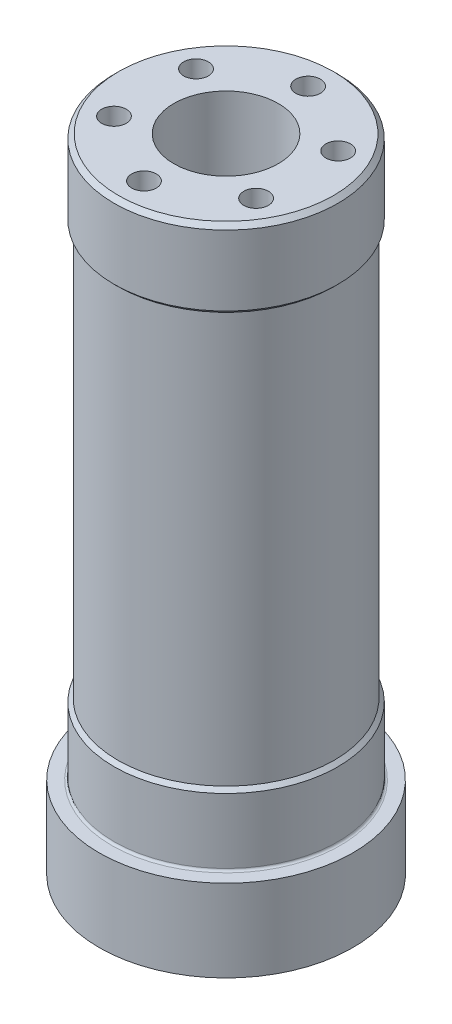
ISO-10303-21;
HEADER;
FILE_DESCRIPTION(('STEP AP214'),'2;1');
FILE_NAME('part.step','',(''),(''),'','','');
FILE_SCHEMA(('AUTOMOTIVE_DESIGN { 1 0 10303 214 1 1 1 1 }'));
ENDSEC;
DATA;
#1=APPLICATION_CONTEXT('core data for automotive mechanical design processes');
#2=APPLICATION_PROTOCOL_DEFINITION('international standard','automotive_design',2000,#1);
#3=PRODUCT_CONTEXT('',#1,'mechanical');
#4=PRODUCT('Part','Part','',(#3));
#5=PRODUCT_RELATED_PRODUCT_CATEGORY('part','',(#4));
#6=PRODUCT_DEFINITION_FORMATION('','',#4);
#7=PRODUCT_DEFINITION_CONTEXT('part definition',#1,'design');
#8=PRODUCT_DEFINITION('design','',#6,#7);
#9=PRODUCT_DEFINITION_SHAPE('','',#8);
#10=(LENGTH_UNIT() NAMED_UNIT(*) SI_UNIT(.MILLI.,.METRE.));
#11=(NAMED_UNIT(*) PLANE_ANGLE_UNIT() SI_UNIT($,.RADIAN.));
#12=(NAMED_UNIT(*) SI_UNIT($,.STERADIAN.) SOLID_ANGLE_UNIT());
#13=UNCERTAINTY_MEASURE_WITH_UNIT(LENGTH_MEASURE(1.E-05),#10,'distance_accuracy_value','');
#14=(GEOMETRIC_REPRESENTATION_CONTEXT(3) GLOBAL_UNCERTAINTY_ASSIGNED_CONTEXT((#13)) GLOBAL_UNIT_ASSIGNED_CONTEXT((#10,
#11,#12)) REPRESENTATION_CONTEXT('',''));
#15=CARTESIAN_POINT('',(0.,0.,0.));
#16=DIRECTION('',(0.,0.,1.));
#17=DIRECTION('',(1.,0.,0.));
#18=AXIS2_PLACEMENT_3D('',#15,#16,#17);
#19=CARTESIAN_POINT('',(0.,110.959510929026,-40.));
#20=DIRECTION('',(0.,1.,0.));
#21=DIRECTION('',(0.,0.,1.));
#22=AXIS2_PLACEMENT_3D('',#19,#20,#21);
#23=CYLINDRICAL_SURFACE('',#22,15.);
#24=CARTESIAN_POINT('',(0.,27.8,-40.));
#25=DIRECTION('',(0.,-1.,0.));
#26=DIRECTION('',(0.,0.,-1.));
#27=AXIS2_PLACEMENT_3D('',#24,#25,#26);
#28=CIRCLE('',#27,15.);
#29=CARTESIAN_POINT('',(0.,27.8,-55.));
#30=VERTEX_POINT('',#29);
#31=EDGE_CURVE('E188',#30,#30,#28,.F.);
#32=ORIENTED_EDGE('',*,*,#31,.T.);
#33=EDGE_LOOP('',(#32));
#34=FACE_BOUND('',#33,.T.);
#35=CARTESIAN_POINT('',(0.,36.5,-40.));
#36=DIRECTION('',(0.,1.,0.));
#37=DIRECTION('',(0.,0.,1.));
#38=AXIS2_PLACEMENT_3D('',#35,#36,#37);
#39=CIRCLE('',#38,15.);
#40=CARTESIAN_POINT('',(0.,36.5,-25.));
#41=VERTEX_POINT('',#40);
#42=EDGE_CURVE('E179',#41,#41,#39,.T.);
#43=ORIENTED_EDGE('',*,*,#42,.F.);
#44=EDGE_LOOP('',(#43));
#45=FACE_BOUND('',#44,.T.);
#46=ADVANCED_FACE('F53',(#34,#45),#23,.T.);
#47=CARTESIAN_POINT('',(0.,110.959510929026,-40.));
#48=DIRECTION('',(0.,1.,0.));
#49=DIRECTION('',(0.,0.,1.));
#50=AXIS2_PLACEMENT_3D('',#47,#48,#49);
#51=CYLINDRICAL_SURFACE('',#50,14.5);
#52=CARTESIAN_POINT('',(0.,37.,-40.));
#53=DIRECTION('',(0.,-1.,0.));
#54=DIRECTION('',(0.,0.,-1.));
#55=AXIS2_PLACEMENT_3D('',#52,#53,#54);
#56=CIRCLE('',#55,14.5);
#57=CARTESIAN_POINT('',(0.,37.,-54.5));
#58=VERTEX_POINT('',#57);
#59=EDGE_CURVE('E197',#58,#58,#56,.F.);
#60=ORIENTED_EDGE('',*,*,#59,.T.);
#61=EDGE_LOOP('',(#60));
#62=FACE_BOUND('',#61,.T.);
#63=CARTESIAN_POINT('',(0.,92.,-40.));
#64=DIRECTION('',(0.,1.,0.));
#65=DIRECTION('',(0.,0.,1.));
#66=AXIS2_PLACEMENT_3D('',#63,#64,#65);
#67=CIRCLE('',#66,14.5);
#68=CARTESIAN_POINT('',(0.,92.,-25.5));
#69=VERTEX_POINT('',#68);
#70=EDGE_CURVE('E194',#69,#69,#67,.F.);
#71=ORIENTED_EDGE('',*,*,#70,.T.);
#72=EDGE_LOOP('',(#71));
#73=FACE_BOUND('',#72,.T.);
#74=ADVANCED_FACE('F216',(#62,#73),#51,.T.);
#75=CARTESIAN_POINT('',(0.,110.959510929026,-40.));
#76=DIRECTION('',(0.,1.,0.));
#77=DIRECTION('',(0.,0.,1.));
#78=AXIS2_PLACEMENT_3D('',#75,#76,#77);
#79=CYLINDRICAL_SURFACE('',#78,15.);
#80=CARTESIAN_POINT('',(0.,101.9,-40.));
#81=DIRECTION('',(0.,-1.,0.));
#82=DIRECTION('',(0.,0.,-1.));
#83=AXIS2_PLACEMENT_3D('',#80,#81,#82);
#84=CIRCLE('',#83,15.);
#85=CARTESIAN_POINT('',(0.,101.9,-55.));
#86=VERTEX_POINT('',#85);
#87=EDGE_CURVE('E185',#86,#86,#84,.T.);
#88=ORIENTED_EDGE('',*,*,#87,.T.);
#89=EDGE_LOOP('',(#88));
#90=FACE_BOUND('',#89,.T.);
#91=CARTESIAN_POINT('',(0.,92.5,-40.));
#92=DIRECTION('',(0.,1.,0.));
#93=DIRECTION('',(0.,0.,1.));
#94=AXIS2_PLACEMENT_3D('',#91,#92,#93);
#95=CIRCLE('',#94,15.);
#96=CARTESIAN_POINT('',(0.,92.5,-25.));
#97=VERTEX_POINT('',#96);
#98=EDGE_CURVE('E176',#97,#97,#95,.T.);
#99=ORIENTED_EDGE('',*,*,#98,.T.);
#100=EDGE_LOOP('',(#99));
#101=FACE_BOUND('',#100,.T.);
#102=ADVANCED_FACE('F224',(#90,#101),#79,.T.);
#103=CARTESIAN_POINT('',(0.,102.5,-55.));
#104=DIRECTION('',(0.,-1.,0.));
#105=DIRECTION('',(0.,0.,-1.));
#106=AXIS2_PLACEMENT_3D('',#103,#104,#105);
#107=PLANE('',#106);
#108=CARTESIAN_POINT('',(0.,102.5,-40.));
#109=DIRECTION('',(0.,-1.,0.));
#110=DIRECTION('',(0.,0.,-1.));
#111=AXIS2_PLACEMENT_3D('',#108,#109,#110);
#112=CIRCLE('',#111,14.4);
#113=CARTESIAN_POINT('',(0.,102.5,-54.4));
#114=VERTEX_POINT('',#113);
#115=EDGE_CURVE('E182',#114,#114,#112,.F.);
#116=ORIENTED_EDGE('',*,*,#115,.T.);
#117=EDGE_LOOP('',(#116));
#118=FACE_BOUND('',#117,.T.);
#119=CARTESIAN_POINT('',(0.,102.5,-51.));
#120=DIRECTION('',(0.,1.,0.));
#121=DIRECTION('',(0.,0.,1.));
#122=AXIS2_PLACEMENT_3D('',#119,#120,#121);
#123=CIRCLE('',#122,1.64999999999999);
#124=CARTESIAN_POINT('',(0.,102.5,-49.35));
#125=VERTEX_POINT('',#124);
#126=EDGE_CURVE('E125',#125,#125,#123,.T.);
#127=ORIENTED_EDGE('',*,*,#126,.F.);
#128=EDGE_LOOP('',(#127));
#129=FACE_BOUND('',#128,.T.);
#130=CARTESIAN_POINT('',(9.52627944162883,102.5,-45.5));
#131=DIRECTION('',(0.,1.,0.));
#132=DIRECTION('',(0.,0.,1.));
#133=AXIS2_PLACEMENT_3D('',#130,#131,#132);
#134=CIRCLE('',#133,1.64999999999999);
#135=CARTESIAN_POINT('',(9.52627944162883,102.5,-43.85));
#136=VERTEX_POINT('',#135);
#137=EDGE_CURVE('E131',#136,#136,#134,.T.);
#138=ORIENTED_EDGE('',*,*,#137,.F.);
#139=EDGE_LOOP('',(#138));
#140=FACE_BOUND('',#139,.T.);
#141=CARTESIAN_POINT('',(9.52627944162884,102.5,-34.5));
#142=DIRECTION('',(0.,1.,0.));
#143=DIRECTION('',(0.,0.,1.));
#144=AXIS2_PLACEMENT_3D('',#141,#142,#143);
#145=CIRCLE('',#144,1.64999999999999);
#146=CARTESIAN_POINT('',(9.52627944162884,102.5,-32.85));
#147=VERTEX_POINT('',#146);
#148=EDGE_CURVE('E137',#147,#147,#145,.T.);
#149=ORIENTED_EDGE('',*,*,#148,.F.);
#150=EDGE_LOOP('',(#149));
#151=FACE_BOUND('',#150,.T.);
#152=CARTESIAN_POINT('',(-9.52627944162883,102.5,-45.5));
#153=DIRECTION('',(0.,1.,0.));
#154=DIRECTION('',(0.,0.,1.));
#155=AXIS2_PLACEMENT_3D('',#152,#153,#154);
#156=CIRCLE('',#155,1.64999999999999);
#157=CARTESIAN_POINT('',(-9.52627944162883,102.5,-43.85));
#158=VERTEX_POINT('',#157);
#159=EDGE_CURVE('E143',#158,#158,#156,.T.);
#160=ORIENTED_EDGE('',*,*,#159,.F.);
#161=EDGE_LOOP('',(#160));
#162=FACE_BOUND('',#161,.T.);
#163=CARTESIAN_POINT('',(-9.52627944162883,102.5,-34.5));
#164=DIRECTION('',(0.,1.,0.));
#165=DIRECTION('',(0.,0.,1.));
#166=AXIS2_PLACEMENT_3D('',#163,#164,#165);
#167=CIRCLE('',#166,1.64999999999999);
#168=CARTESIAN_POINT('',(-9.52627944162883,102.5,-32.85));
#169=VERTEX_POINT('',#168);
#170=EDGE_CURVE('E149',#169,#169,#167,.T.);
#171=ORIENTED_EDGE('',*,*,#170,.F.);
#172=EDGE_LOOP('',(#171));
#173=FACE_BOUND('',#172,.T.);
#174=CARTESIAN_POINT('',(0.,102.5,-29.));
#175=DIRECTION('',(0.,1.,0.));
#176=DIRECTION('',(0.,0.,1.));
#177=AXIS2_PLACEMENT_3D('',#174,#175,#176);
#178=CIRCLE('',#177,1.64999999999999);
#179=CARTESIAN_POINT('',(0.,102.5,-27.35));
#180=VERTEX_POINT('',#179);
#181=EDGE_CURVE('E155',#180,#180,#178,.T.);
#182=ORIENTED_EDGE('',*,*,#181,.F.);
#183=EDGE_LOOP('',(#182));
#184=FACE_BOUND('',#183,.T.);
#185=CARTESIAN_POINT('',(0.,102.5,-40.));
#186=DIRECTION('',(0.,1.,0.));
#187=DIRECTION('',(0.,0.,1.));
#188=AXIS2_PLACEMENT_3D('',#185,#186,#187);
#189=CIRCLE('',#188,7.);
#190=CARTESIAN_POINT('',(0.,102.5,-33.));
#191=VERTEX_POINT('',#190);
#192=EDGE_CURVE('E173',#191,#191,#189,.T.);
#193=ORIENTED_EDGE('',*,*,#192,.F.);
#194=EDGE_LOOP('',(#193));
#195=FACE_BOUND('',#194,.T.);
#196=ADVANCED_FACE('F259',(#118,#129,#140,#151,#162,#173,#184,#195),#107,.F.);
#197=CARTESIAN_POINT('',(0.,110.959510929026,-40.));
#198=DIRECTION('',(0.,1.,0.));
#199=DIRECTION('',(0.,0.,1.));
#200=AXIS2_PLACEMENT_3D('',#197,#198,#199);
#201=CYLINDRICAL_SURFACE('',#200,7.);
#202=CARTESIAN_POINT('',(0.,14.5,-40.));
#203=DIRECTION('',(0.,1.,0.));
#204=DIRECTION('',(0.,0.,1.));
#205=AXIS2_PLACEMENT_3D('',#202,#203,#204);
#206=CIRCLE('',#205,7.00000000000001);
#207=CARTESIAN_POINT('',(0.,14.5,-33.));
#208=VERTEX_POINT('',#207);
#209=EDGE_CURVE('E170',#208,#208,#206,.T.);
#210=ORIENTED_EDGE('',*,*,#209,.F.);
#211=EDGE_LOOP('',(#210));
#212=FACE_BOUND('',#211,.T.);
#213=ORIENTED_EDGE('',*,*,#192,.T.);
#214=EDGE_LOOP('',(#213));
#215=FACE_BOUND('',#214,.T.);
#216=ADVANCED_FACE('F265',(#212,#215),#201,.F.);
#217=CARTESIAN_POINT('',(0.,14.5,-47.));
#218=DIRECTION('',(0.,1.,0.));
#219=DIRECTION('',(0.,0.,1.));
#220=AXIS2_PLACEMENT_3D('',#217,#218,#219);
#221=PLANE('',#220);
#222=CARTESIAN_POINT('',(0.,14.5,-40.));
#223=DIRECTION('',(0.,1.,0.));
#224=DIRECTION('',(0.,0.,1.));
#225=AXIS2_PLACEMENT_3D('',#222,#223,#224);
#226=CIRCLE('',#225,8.50000000000001);
#227=CARTESIAN_POINT('',(0.,14.5,-31.5));
#228=VERTEX_POINT('',#227);
#229=EDGE_CURVE('E167',#228,#228,#226,.T.);
#230=ORIENTED_EDGE('',*,*,#229,.F.);
#231=EDGE_LOOP('',(#230));
#232=FACE_BOUND('',#231,.T.);
#233=ORIENTED_EDGE('',*,*,#209,.T.);
#234=EDGE_LOOP('',(#233));
#235=FACE_BOUND('',#234,.T.);
#236=ADVANCED_FACE('F271',(#232,#235),#221,.F.);
#237=CARTESIAN_POINT('',(0.,110.959510929026,-40.));
#238=DIRECTION('',(0.,1.,0.));
#239=DIRECTION('',(0.,0.,1.));
#240=AXIS2_PLACEMENT_3D('',#237,#238,#239);
#241=CYLINDRICAL_SURFACE('',#240,8.50000000000001);
#242=CARTESIAN_POINT('',(0.,16.1,-40.));
#243=DIRECTION('',(0.,1.,0.));
#244=DIRECTION('',(0.,0.,1.));
#245=AXIS2_PLACEMENT_3D('',#242,#243,#244);
#246=CIRCLE('',#245,8.50000000000001);
#247=CARTESIAN_POINT('',(0.,16.1,-31.5));
#248=VERTEX_POINT('',#247);
#249=EDGE_CURVE('E11',#248,#248,#246,.F.);
#250=ORIENTED_EDGE('',*,*,#249,.T.);
#251=EDGE_LOOP('',(#250));
#252=FACE_BOUND('',#251,.T.);
#253=ORIENTED_EDGE('',*,*,#229,.T.);
#254=EDGE_LOOP('',(#253));
#255=FACE_BOUND('',#254,.T.);
#256=ADVANCED_FACE('F275',(#252,#255),#241,.T.);
#257=CARTESIAN_POINT('',(0.,16.5,-57.));
#258=DIRECTION('',(0.,1.,0.));
#259=DIRECTION('',(0.,0.,1.));
#260=AXIS2_PLACEMENT_3D('',#257,#258,#259);
#261=PLANE('',#260);
#262=CARTESIAN_POINT('',(0.,16.5,-40.));
#263=DIRECTION('',(0.,1.,0.));
#264=DIRECTION('',(0.,0.,1.));
#265=AXIS2_PLACEMENT_3D('',#262,#263,#264);
#266=CIRCLE('',#265,8.90000000000001);
#267=CARTESIAN_POINT('',(0.,16.5,-31.1));
#268=VERTEX_POINT('',#267);
#269=EDGE_CURVE('E61',#268,#268,#266,.T.);
#270=ORIENTED_EDGE('',*,*,#269,.T.);
#271=EDGE_LOOP('',(#270));
#272=FACE_BOUND('',#271,.T.);
#273=CARTESIAN_POINT('',(9.01561146012851,16.5,-49.0156114601285));
#274=DIRECTION('',(0.,-1.,0.));
#275=DIRECTION('',(0.,0.,-1.));
#276=AXIS2_PLACEMENT_3D('',#273,#274,#275);
#277=CIRCLE('',#276,2.09999999999999);
#278=CARTESIAN_POINT('',(9.01561146012851,16.5,-51.1156114601285));
#279=VERTEX_POINT('',#278);
#280=EDGE_CURVE('E103',#279,#279,#277,.T.);
#281=ORIENTED_EDGE('',*,*,#280,.F.);
#282=EDGE_LOOP('',(#281));
#283=FACE_BOUND('',#282,.T.);
#284=CARTESIAN_POINT('',(-9.01561146012851,16.5,-49.0156114601285));
#285=DIRECTION('',(0.,-1.,0.));
#286=DIRECTION('',(0.,0.,-1.));
#287=AXIS2_PLACEMENT_3D('',#284,#285,#286);
#288=CIRCLE('',#287,2.09999999999999);
#289=CARTESIAN_POINT('',(-9.01561146012851,16.5,-51.1156114601285));
#290=VERTEX_POINT('',#289);
#291=EDGE_CURVE('E102',#290,#290,#288,.T.);
#292=ORIENTED_EDGE('',*,*,#291,.F.);
#293=EDGE_LOOP('',(#292));
#294=FACE_BOUND('',#293,.T.);
#295=CARTESIAN_POINT('',(7.23273807074473,16.5,-29.5));
#296=DIRECTION('',(0.,-1.,0.));
#297=DIRECTION('',(0.,0.,-1.));
#298=AXIS2_PLACEMENT_3D('',#295,#296,#297);
#299=CIRCLE('',#298,2.09999999999999);
#300=CARTESIAN_POINT('',(7.23273807074473,16.5,-31.6));
#301=VERTEX_POINT('',#300);
#302=EDGE_CURVE('E113',#301,#301,#299,.T.);
#303=ORIENTED_EDGE('',*,*,#302,.F.);
#304=EDGE_LOOP('',(#303));
#305=FACE_BOUND('',#304,.T.);
#306=CARTESIAN_POINT('',(-7.23273807074473,16.5,-29.5));
#307=DIRECTION('',(0.,-1.,0.));
#308=DIRECTION('',(0.,0.,-1.));
#309=AXIS2_PLACEMENT_3D('',#306,#307,#308);
#310=CIRCLE('',#309,2.09999999999999);
#311=CARTESIAN_POINT('',(-7.23273807074473,16.5,-31.6));
#312=VERTEX_POINT('',#311);
#313=EDGE_CURVE('E119',#312,#312,#310,.T.);
#314=ORIENTED_EDGE('',*,*,#313,.F.);
#315=EDGE_LOOP('',(#314));
#316=FACE_BOUND('',#315,.T.);
#317=CARTESIAN_POINT('',(0.,16.5,-40.));
#318=DIRECTION('',(0.,1.,0.));
#319=DIRECTION('',(0.,0.,1.));
#320=AXIS2_PLACEMENT_3D('',#317,#318,#319);
#321=CIRCLE('',#320,17.);
#322=CARTESIAN_POINT('',(0.,16.5,-23.));
#323=VERTEX_POINT('',#322);
#324=EDGE_CURVE('E164',#323,#323,#321,.T.);
#325=ORIENTED_EDGE('',*,*,#324,.F.);
#326=EDGE_LOOP('',(#325));
#327=FACE_BOUND('',#326,.T.);
#328=ADVANCED_FACE('F202',(#272,#283,#294,#305,#316,#327),#261,.F.);
#329=CARTESIAN_POINT('',(0.,110.959510929026,-40.));
#330=DIRECTION('',(0.,1.,0.));
#331=DIRECTION('',(0.,0.,1.));
#332=AXIS2_PLACEMENT_3D('',#329,#330,#331);
#333=CYLINDRICAL_SURFACE('',#332,17.);
#334=CARTESIAN_POINT('',(0.,27.5,-40.));
#335=DIRECTION('',(0.,1.,0.));
#336=DIRECTION('',(0.,0.,1.));
#337=AXIS2_PLACEMENT_3D('',#334,#335,#336);
#338=CIRCLE('',#337,17.);
#339=CARTESIAN_POINT('',(0.,27.5,-23.));
#340=VERTEX_POINT('',#339);
#341=EDGE_CURVE('E161',#340,#340,#338,.T.);
#342=ORIENTED_EDGE('',*,*,#341,.F.);
#343=EDGE_LOOP('',(#342));
#344=FACE_BOUND('',#343,.T.);
#345=ORIENTED_EDGE('',*,*,#324,.T.);
#346=EDGE_LOOP('',(#345));
#347=FACE_BOUND('',#346,.T.);
#348=ADVANCED_FACE('F281',(#344,#347),#333,.T.);
#349=CARTESIAN_POINT('',(0.,27.5,-55.));
#350=DIRECTION('',(0.,-1.,0.));
#351=DIRECTION('',(0.,0.,-1.));
#352=AXIS2_PLACEMENT_3D('',#349,#350,#351);
#353=PLANE('',#352);
#354=CARTESIAN_POINT('',(0.,27.5,-40.));
#355=DIRECTION('',(0.,-1.,0.));
#356=DIRECTION('',(0.,0.,-1.));
#357=AXIS2_PLACEMENT_3D('',#354,#355,#356);
#358=CIRCLE('',#357,15.3);
#359=CARTESIAN_POINT('',(0.,27.5,-55.3));
#360=VERTEX_POINT('',#359);
#361=EDGE_CURVE('E191',#360,#360,#358,.T.);
#362=ORIENTED_EDGE('',*,*,#361,.T.);
#363=EDGE_LOOP('',(#362));
#364=FACE_BOUND('',#363,.T.);
#365=ORIENTED_EDGE('',*,*,#341,.T.);
#366=EDGE_LOOP('',(#365));
#367=FACE_BOUND('',#366,.T.);
#368=ADVANCED_FACE('F284',(#364,#367),#353,.F.);
#369=CARTESIAN_POINT('',(0.,91.,-29.));
#370=DIRECTION('',(0.,1.,0.));
#371=DIRECTION('',(0.,0.,1.));
#372=AXIS2_PLACEMENT_3D('',#369,#370,#371);
#373=CONICAL_SURFACE('',#372,1.64999999999999,1.02974425867665);
#374=CARTESIAN_POINT('',(0.,90.0085799786045,-29.));
#375=VERTEX_POINT('',#374);
#376=VERTEX_LOOP('',#375);
#377=FACE_BOUND('',#376,.T.);
#378=CARTESIAN_POINT('',(0.,91.,-29.));
#379=DIRECTION('',(0.,1.,0.));
#380=DIRECTION('',(0.,0.,1.));
#381=AXIS2_PLACEMENT_3D('',#378,#379,#380);
#382=CIRCLE('',#381,1.64999999999999);
#383=CARTESIAN_POINT('',(0.,91.,-27.35));
#384=VERTEX_POINT('',#383);
#385=EDGE_CURVE('E158',#384,#384,#382,.T.);
#386=ORIENTED_EDGE('',*,*,#385,.T.);
#387=EDGE_LOOP('',(#386));
#388=FACE_BOUND('',#387,.T.);
#389=ADVANCED_FACE('F287',(#377,#388),#373,.F.);
#390=CARTESIAN_POINT('',(0.,102.5,-29.));
#391=DIRECTION('',(0.,1.,0.));
#392=DIRECTION('',(0.,0.,1.));
#393=AXIS2_PLACEMENT_3D('',#390,#391,#392);
#394=CYLINDRICAL_SURFACE('',#393,1.64999999999999);
#395=ORIENTED_EDGE('',*,*,#385,.F.);
#396=EDGE_LOOP('',(#395));
#397=FACE_BOUND('',#396,.T.);
#398=ORIENTED_EDGE('',*,*,#181,.T.);
#399=EDGE_LOOP('',(#398));
#400=FACE_BOUND('',#399,.T.);
#401=ADVANCED_FACE('F291',(#397,#400),#394,.F.);
#402=CARTESIAN_POINT('',(-9.52627944162883,91.,-34.5));
#403=DIRECTION('',(0.,1.,0.));
#404=DIRECTION('',(0.,0.,1.));
#405=AXIS2_PLACEMENT_3D('',#402,#403,#404);
#406=CONICAL_SURFACE('',#405,1.64999999999999,1.02974425867665);
#407=CARTESIAN_POINT('',(-9.52627944162883,90.0085799786045,-34.5));
#408=VERTEX_POINT('',#407);
#409=VERTEX_LOOP('',#408);
#410=FACE_BOUND('',#409,.T.);
#411=CARTESIAN_POINT('',(-9.52627944162883,91.,-34.5));
#412=DIRECTION('',(0.,1.,0.));
#413=DIRECTION('',(0.,0.,1.));
#414=AXIS2_PLACEMENT_3D('',#411,#412,#413);
#415=CIRCLE('',#414,1.64999999999999);
#416=CARTESIAN_POINT('',(-9.52627944162883,91.,-32.85));
#417=VERTEX_POINT('',#416);
#418=EDGE_CURVE('E152',#417,#417,#415,.T.);
#419=ORIENTED_EDGE('',*,*,#418,.T.);
#420=EDGE_LOOP('',(#419));
#421=FACE_BOUND('',#420,.T.);
#422=ADVANCED_FACE('F294',(#410,#421),#406,.F.);
#423=CARTESIAN_POINT('',(-9.52627944162883,102.5,-34.5));
#424=DIRECTION('',(0.,1.,0.));
#425=DIRECTION('',(0.,0.,1.));
#426=AXIS2_PLACEMENT_3D('',#423,#424,#425);
#427=CYLINDRICAL_SURFACE('',#426,1.64999999999999);
#428=ORIENTED_EDGE('',*,*,#418,.F.);
#429=EDGE_LOOP('',(#428));
#430=FACE_BOUND('',#429,.T.);
#431=ORIENTED_EDGE('',*,*,#170,.T.);
#432=EDGE_LOOP('',(#431));
#433=FACE_BOUND('',#432,.T.);
#434=ADVANCED_FACE('F298',(#430,#433),#427,.F.);
#435=CARTESIAN_POINT('',(-9.52627944162883,91.,-45.5));
#436=DIRECTION('',(0.,1.,0.));
#437=DIRECTION('',(0.,0.,1.));
#438=AXIS2_PLACEMENT_3D('',#435,#436,#437);
#439=CONICAL_SURFACE('',#438,1.64999999999999,1.02974425867665);
#440=CARTESIAN_POINT('',(-9.52627944162883,90.0085799786045,-45.5));
#441=VERTEX_POINT('',#440);
#442=VERTEX_LOOP('',#441);
#443=FACE_BOUND('',#442,.T.);
#444=CARTESIAN_POINT('',(-9.52627944162883,91.,-45.5));
#445=DIRECTION('',(0.,1.,0.));
#446=DIRECTION('',(0.,0.,1.));
#447=AXIS2_PLACEMENT_3D('',#444,#445,#446);
#448=CIRCLE('',#447,1.64999999999999);
#449=CARTESIAN_POINT('',(-9.52627944162883,91.,-43.85));
#450=VERTEX_POINT('',#449);
#451=EDGE_CURVE('E146',#450,#450,#448,.T.);
#452=ORIENTED_EDGE('',*,*,#451,.T.);
#453=EDGE_LOOP('',(#452));
#454=FACE_BOUND('',#453,.T.);
#455=ADVANCED_FACE('F301',(#443,#454),#439,.F.);
#456=CARTESIAN_POINT('',(-9.52627944162883,102.5,-45.5));
#457=DIRECTION('',(0.,1.,0.));
#458=DIRECTION('',(0.,0.,1.));
#459=AXIS2_PLACEMENT_3D('',#456,#457,#458);
#460=CYLINDRICAL_SURFACE('',#459,1.64999999999999);
#461=ORIENTED_EDGE('',*,*,#451,.F.);
#462=EDGE_LOOP('',(#461));
#463=FACE_BOUND('',#462,.T.);
#464=ORIENTED_EDGE('',*,*,#159,.T.);
#465=EDGE_LOOP('',(#464));
#466=FACE_BOUND('',#465,.T.);
#467=ADVANCED_FACE('F305',(#463,#466),#460,.F.);
#468=CARTESIAN_POINT('',(9.52627944162884,91.,-34.5));
#469=DIRECTION('',(0.,1.,0.));
#470=DIRECTION('',(0.,0.,1.));
#471=AXIS2_PLACEMENT_3D('',#468,#469,#470);
#472=CONICAL_SURFACE('',#471,1.64999999999999,1.02974425867665);
#473=CARTESIAN_POINT('',(9.52627944162883,90.0085799786045,-34.5));
#474=VERTEX_POINT('',#473);
#475=VERTEX_LOOP('',#474);
#476=FACE_BOUND('',#475,.T.);
#477=CARTESIAN_POINT('',(9.52627944162884,91.,-34.5));
#478=DIRECTION('',(0.,1.,0.));
#479=DIRECTION('',(0.,0.,1.));
#480=AXIS2_PLACEMENT_3D('',#477,#478,#479);
#481=CIRCLE('',#480,1.64999999999999);
#482=CARTESIAN_POINT('',(9.52627944162884,91.,-32.85));
#483=VERTEX_POINT('',#482);
#484=EDGE_CURVE('E140',#483,#483,#481,.T.);
#485=ORIENTED_EDGE('',*,*,#484,.T.);
#486=EDGE_LOOP('',(#485));
#487=FACE_BOUND('',#486,.T.);
#488=ADVANCED_FACE('F309',(#476,#487),#472,.F.);
#489=CARTESIAN_POINT('',(9.52627944162884,102.5,-34.5));
#490=DIRECTION('',(0.,1.,0.));
#491=DIRECTION('',(0.,0.,1.));
#492=AXIS2_PLACEMENT_3D('',#489,#490,#491);
#493=CYLINDRICAL_SURFACE('',#492,1.64999999999999);
#494=ORIENTED_EDGE('',*,*,#484,.F.);
#495=EDGE_LOOP('',(#494));
#496=FACE_BOUND('',#495,.T.);
#497=ORIENTED_EDGE('',*,*,#148,.T.);
#498=EDGE_LOOP('',(#497));
#499=FACE_BOUND('',#498,.T.);
#500=ADVANCED_FACE('F313',(#496,#499),#493,.F.);
#501=CARTESIAN_POINT('',(9.52627944162883,91.,-45.5));
#502=DIRECTION('',(0.,1.,0.));
#503=DIRECTION('',(0.,0.,1.));
#504=AXIS2_PLACEMENT_3D('',#501,#502,#503);
#505=CONICAL_SURFACE('',#504,1.64999999999999,1.02974425867665);
#506=CARTESIAN_POINT('',(9.52627944162883,90.0085799786045,-45.5));
#507=VERTEX_POINT('',#506);
#508=VERTEX_LOOP('',#507);
#509=FACE_BOUND('',#508,.T.);
#510=CARTESIAN_POINT('',(9.52627944162883,91.,-45.5));
#511=DIRECTION('',(0.,1.,0.));
#512=DIRECTION('',(0.,0.,1.));
#513=AXIS2_PLACEMENT_3D('',#510,#511,#512);
#514=CIRCLE('',#513,1.64999999999999);
#515=CARTESIAN_POINT('',(9.52627944162883,91.,-43.85));
#516=VERTEX_POINT('',#515);
#517=EDGE_CURVE('E134',#516,#516,#514,.T.);
#518=ORIENTED_EDGE('',*,*,#517,.T.);
#519=EDGE_LOOP('',(#518));
#520=FACE_BOUND('',#519,.T.);
#521=ADVANCED_FACE('F317',(#509,#520),#505,.F.);
#522=CARTESIAN_POINT('',(9.52627944162883,102.5,-45.5));
#523=DIRECTION('',(0.,1.,0.));
#524=DIRECTION('',(0.,0.,1.));
#525=AXIS2_PLACEMENT_3D('',#522,#523,#524);
#526=CYLINDRICAL_SURFACE('',#525,1.64999999999999);
#527=ORIENTED_EDGE('',*,*,#517,.F.);
#528=EDGE_LOOP('',(#527));
#529=FACE_BOUND('',#528,.T.);
#530=ORIENTED_EDGE('',*,*,#137,.T.);
#531=EDGE_LOOP('',(#530));
#532=FACE_BOUND('',#531,.T.);
#533=ADVANCED_FACE('F321',(#529,#532),#526,.F.);
#534=CARTESIAN_POINT('',(0.,91.,-51.));
#535=DIRECTION('',(0.,1.,0.));
#536=DIRECTION('',(0.,0.,1.));
#537=AXIS2_PLACEMENT_3D('',#534,#535,#536);
#538=CONICAL_SURFACE('',#537,1.64999999999999,1.02974425867665);
#539=CARTESIAN_POINT('',(0.,90.0085799786045,-51.));
#540=VERTEX_POINT('',#539);
#541=VERTEX_LOOP('',#540);
#542=FACE_BOUND('',#541,.T.);
#543=CARTESIAN_POINT('',(0.,91.,-51.));
#544=DIRECTION('',(0.,1.,0.));
#545=DIRECTION('',(0.,0.,1.));
#546=AXIS2_PLACEMENT_3D('',#543,#544,#545);
#547=CIRCLE('',#546,1.64999999999999);
#548=CARTESIAN_POINT('',(0.,91.,-49.35));
#549=VERTEX_POINT('',#548);
#550=EDGE_CURVE('E128',#549,#549,#547,.T.);
#551=ORIENTED_EDGE('',*,*,#550,.T.);
#552=EDGE_LOOP('',(#551));
#553=FACE_BOUND('',#552,.T.);
#554=ADVANCED_FACE('F325',(#542,#553),#538,.F.);
#555=CARTESIAN_POINT('',(0.,102.5,-51.));
#556=DIRECTION('',(0.,1.,0.));
#557=DIRECTION('',(0.,0.,1.));
#558=AXIS2_PLACEMENT_3D('',#555,#556,#557);
#559=CYLINDRICAL_SURFACE('',#558,1.64999999999999);
#560=ORIENTED_EDGE('',*,*,#550,.F.);
#561=EDGE_LOOP('',(#560));
#562=FACE_BOUND('',#561,.T.);
#563=ORIENTED_EDGE('',*,*,#126,.T.);
#564=EDGE_LOOP('',(#563));
#565=FACE_BOUND('',#564,.T.);
#566=ADVANCED_FACE('F329',(#562,#565),#559,.F.);
#567=CARTESIAN_POINT('',(-7.23273807074473,26.5,-29.5));
#568=DIRECTION('',(0.,-1.,0.));
#569=DIRECTION('',(0.,0.,-1.));
#570=AXIS2_PLACEMENT_3D('',#567,#568,#569);
#571=CONICAL_SURFACE('',#570,2.1,1.02974425867665);
#572=CARTESIAN_POINT('',(-7.23273807074474,27.7618072999579,-29.5));
#573=VERTEX_POINT('',#572);
#574=VERTEX_LOOP('',#573);
#575=FACE_BOUND('',#574,.T.);
#576=CARTESIAN_POINT('',(-7.23273807074473,26.5,-29.5));
#577=DIRECTION('',(0.,-1.,0.));
#578=DIRECTION('',(0.,0.,-1.));
#579=AXIS2_PLACEMENT_3D('',#576,#577,#578);
#580=CIRCLE('',#579,2.1);
#581=CARTESIAN_POINT('',(-7.23273807074473,26.5,-31.6));
#582=VERTEX_POINT('',#581);
#583=EDGE_CURVE('E122',#582,#582,#580,.T.);
#584=ORIENTED_EDGE('',*,*,#583,.T.);
#585=EDGE_LOOP('',(#584));
#586=FACE_BOUND('',#585,.T.);
#587=ADVANCED_FACE('F333',(#575,#586),#571,.F.);
#588=CARTESIAN_POINT('',(-7.23273807074473,16.5,-29.5));
#589=DIRECTION('',(0.,-1.,0.));
#590=DIRECTION('',(0.,0.,-1.));
#591=AXIS2_PLACEMENT_3D('',#588,#589,#590);
#592=CYLINDRICAL_SURFACE('',#591,2.09999999999999);
#593=ORIENTED_EDGE('',*,*,#583,.F.);
#594=EDGE_LOOP('',(#593));
#595=FACE_BOUND('',#594,.T.);
#596=ORIENTED_EDGE('',*,*,#313,.T.);
#597=EDGE_LOOP('',(#596));
#598=FACE_BOUND('',#597,.T.);
#599=ADVANCED_FACE('F337',(#595,#598),#592,.F.);
#600=CARTESIAN_POINT('',(7.23273807074473,26.5,-29.5));
#601=DIRECTION('',(0.,-1.,0.));
#602=DIRECTION('',(0.,0.,-1.));
#603=AXIS2_PLACEMENT_3D('',#600,#601,#602);
#604=CONICAL_SURFACE('',#603,2.1,1.02974425867665);
#605=CARTESIAN_POINT('',(7.23273807074473,27.7618072999579,-29.5));
#606=VERTEX_POINT('',#605);
#607=VERTEX_LOOP('',#606);
#608=FACE_BOUND('',#607,.T.);
#609=CARTESIAN_POINT('',(7.23273807074473,26.5,-29.5));
#610=DIRECTION('',(0.,-1.,0.));
#611=DIRECTION('',(0.,0.,-1.));
#612=AXIS2_PLACEMENT_3D('',#609,#610,#611);
#613=CIRCLE('',#612,2.1);
#614=CARTESIAN_POINT('',(7.23273807074473,26.5,-31.6));
#615=VERTEX_POINT('',#614);
#616=EDGE_CURVE('E116',#615,#615,#613,.T.);
#617=ORIENTED_EDGE('',*,*,#616,.T.);
#618=EDGE_LOOP('',(#617));
#619=FACE_BOUND('',#618,.T.);
#620=ADVANCED_FACE('F341',(#608,#619),#604,.F.);
#621=CARTESIAN_POINT('',(7.23273807074473,16.5,-29.5));
#622=DIRECTION('',(0.,-1.,0.));
#623=DIRECTION('',(0.,0.,-1.));
#624=AXIS2_PLACEMENT_3D('',#621,#622,#623);
#625=CYLINDRICAL_SURFACE('',#624,2.09999999999999);
#626=ORIENTED_EDGE('',*,*,#616,.F.);
#627=EDGE_LOOP('',(#626));
#628=FACE_BOUND('',#627,.T.);
#629=ORIENTED_EDGE('',*,*,#302,.T.);
#630=EDGE_LOOP('',(#629));
#631=FACE_BOUND('',#630,.T.);
#632=ADVANCED_FACE('F345',(#628,#631),#625,.F.);
#633=CARTESIAN_POINT('',(-9.01561146012851,26.5,-49.0156114601285));
#634=DIRECTION('',(0.,-1.,0.));
#635=DIRECTION('',(0.,0.,-1.));
#636=AXIS2_PLACEMENT_3D('',#633,#634,#635);
#637=CONICAL_SURFACE('',#636,2.1,1.02974425867665);
#638=CARTESIAN_POINT('',(-9.01561146012851,27.7618072999579,-49.0156114601285));
#639=VERTEX_POINT('',#638);
#640=VERTEX_LOOP('',#639);
#641=FACE_BOUND('',#640,.T.);
#642=CARTESIAN_POINT('',(-9.01561146012851,26.5,-49.0156114601285));
#643=DIRECTION('',(0.,-1.,0.));
#644=DIRECTION('',(0.,0.,-1.));
#645=AXIS2_PLACEMENT_3D('',#642,#643,#644);
#646=CIRCLE('',#645,2.1);
#647=CARTESIAN_POINT('',(-9.01561146012851,26.5,-51.1156114601285));
#648=VERTEX_POINT('',#647);
#649=EDGE_CURVE('E106',#648,#648,#646,.T.);
#650=ORIENTED_EDGE('',*,*,#649,.T.);
#651=EDGE_LOOP('',(#650));
#652=FACE_BOUND('',#651,.T.);
#653=ADVANCED_FACE('F349',(#641,#652),#637,.F.);
#654=CARTESIAN_POINT('',(-9.01561146012851,16.5,-49.0156114601285));
#655=DIRECTION('',(0.,-1.,0.));
#656=DIRECTION('',(0.,0.,-1.));
#657=AXIS2_PLACEMENT_3D('',#654,#655,#656);
#658=CYLINDRICAL_SURFACE('',#657,2.09999999999999);
#659=ORIENTED_EDGE('',*,*,#649,.F.);
#660=EDGE_LOOP('',(#659));
#661=FACE_BOUND('',#660,.T.);
#662=ORIENTED_EDGE('',*,*,#291,.T.);
#663=EDGE_LOOP('',(#662));
#664=FACE_BOUND('',#663,.T.);
#665=ADVANCED_FACE('F96',(#661,#664),#658,.F.);
#666=CARTESIAN_POINT('',(9.01561146012851,26.5,-49.0156114601285));
#667=DIRECTION('',(0.,-1.,0.));
#668=DIRECTION('',(0.,0.,-1.));
#669=AXIS2_PLACEMENT_3D('',#666,#667,#668);
#670=CONICAL_SURFACE('',#669,2.1,1.02974425867665);
#671=CARTESIAN_POINT('',(9.01561146012851,27.7618072999579,-49.0156114601285));
#672=VERTEX_POINT('',#671);
#673=VERTEX_LOOP('',#672);
#674=FACE_BOUND('',#673,.T.);
#675=CARTESIAN_POINT('',(9.01561146012851,26.5,-49.0156114601285));
#676=DIRECTION('',(0.,-1.,0.));
#677=DIRECTION('',(0.,0.,-1.));
#678=AXIS2_PLACEMENT_3D('',#675,#676,#677);
#679=CIRCLE('',#678,2.1);
#680=CARTESIAN_POINT('',(9.01561146012851,26.5,-51.1156114601285));
#681=VERTEX_POINT('',#680);
#682=EDGE_CURVE('E100',#681,#681,#679,.T.);
#683=ORIENTED_EDGE('',*,*,#682,.T.);
#684=EDGE_LOOP('',(#683));
#685=FACE_BOUND('',#684,.T.);
#686=ADVANCED_FACE('F92',(#674,#685),#670,.F.);
#687=CARTESIAN_POINT('',(9.01561146012851,16.5,-49.0156114601285));
#688=DIRECTION('',(0.,-1.,0.));
#689=DIRECTION('',(0.,0.,-1.));
#690=AXIS2_PLACEMENT_3D('',#687,#688,#689);
#691=CYLINDRICAL_SURFACE('',#690,2.09999999999999);
#692=ORIENTED_EDGE('',*,*,#682,.F.);
#693=EDGE_LOOP('',(#692));
#694=FACE_BOUND('',#693,.T.);
#695=ORIENTED_EDGE('',*,*,#280,.T.);
#696=EDGE_LOOP('',(#695));
#697=FACE_BOUND('',#696,.T.);
#698=ADVANCED_FACE('F95',(#694,#697),#691,.F.);
#699=CARTESIAN_POINT('',(0.,102.5,-40.));
#700=DIRECTION('',(0.,-1.,0.));
#701=DIRECTION('',(0.,0.,-1.));
#702=AXIS2_PLACEMENT_3D('',#699,#700,#701);
#703=CONICAL_SURFACE('',#702,14.4,0.785398163397445);
#704=ORIENTED_EDGE('',*,*,#87,.F.);
#705=EDGE_LOOP('',(#704));
#706=FACE_BOUND('',#705,.T.);
#707=ORIENTED_EDGE('',*,*,#115,.F.);
#708=EDGE_LOOP('',(#707));
#709=FACE_BOUND('',#708,.T.);
#710=ADVANCED_FACE('F231',(#706,#709),#703,.T.);
#711=CARTESIAN_POINT('',(0.,27.8,-40.));
#712=DIRECTION('',(0.,-1.,0.));
#713=DIRECTION('',(0.,0.,-1.));
#714=AXIS2_PLACEMENT_3D('',#711,#712,#713);
#715=TOROIDAL_SURFACE('',#714,15.3,0.3);
#716=ORIENTED_EDGE('',*,*,#361,.F.);
#717=EDGE_LOOP('',(#716));
#718=FACE_BOUND('',#717,.T.);
#719=ORIENTED_EDGE('',*,*,#31,.F.);
#720=EDGE_LOOP('',(#719));
#721=FACE_BOUND('',#720,.T.);
#722=ADVANCED_FACE('F236',(#718,#721),#715,.F.);
#723=CARTESIAN_POINT('',(0.,37.,-40.));
#724=DIRECTION('',(0.,-1.,0.));
#725=DIRECTION('',(0.,0.,-1.));
#726=AXIS2_PLACEMENT_3D('',#723,#724,#725);
#727=CONICAL_SURFACE('',#726,14.5,0.785398163397438);
#728=ORIENTED_EDGE('',*,*,#42,.T.);
#729=EDGE_LOOP('',(#728));
#730=FACE_BOUND('',#729,.T.);
#731=ORIENTED_EDGE('',*,*,#59,.F.);
#732=EDGE_LOOP('',(#731));
#733=FACE_BOUND('',#732,.T.);
#734=ADVANCED_FACE('F212',(#730,#733),#727,.T.);
#735=CARTESIAN_POINT('',(0.,92.5,-40.));
#736=DIRECTION('',(0.,1.,0.));
#737=DIRECTION('',(0.,0.,1.));
#738=AXIS2_PLACEMENT_3D('',#735,#736,#737);
#739=CONICAL_SURFACE('',#738,15.,0.785398163397452);
#740=ORIENTED_EDGE('',*,*,#70,.F.);
#741=EDGE_LOOP('',(#740));
#742=FACE_BOUND('',#741,.T.);
#743=ORIENTED_EDGE('',*,*,#98,.F.);
#744=EDGE_LOOP('',(#743));
#745=FACE_BOUND('',#744,.T.);
#746=ADVANCED_FACE('F206',(#742,#745),#739,.T.);
#747=CARTESIAN_POINT('',(0.,16.1,-40.));
#748=DIRECTION('',(0.,1.,0.));
#749=DIRECTION('',(0.,0.,1.));
#750=AXIS2_PLACEMENT_3D('',#747,#748,#749);
#751=TOROIDAL_SURFACE('',#750,8.90000000000001,0.4);
#752=ORIENTED_EDGE('',*,*,#249,.F.);
#753=EDGE_LOOP('',(#752));
#754=FACE_BOUND('',#753,.T.);
#755=ORIENTED_EDGE('',*,*,#269,.F.);
#756=EDGE_LOOP('',(#755));
#757=FACE_BOUND('',#756,.T.);
#758=ADVANCED_FACE('F55',(#754,#757),#751,.F.);
#759=CLOSED_SHELL('',(#46,#74,#102,#196,#216,#236,#256,#328,#348,#368,#389,#401,#422,#434,#455,
#467,#488,#500,#521,#533,#554,#566,#587,#599,#620,#632,#653,#665,#686,#698,#710,#722,#734,#746,#758));
#760=MANIFOLD_SOLID_BREP('B2',#759);
#761=ADVANCED_BREP_SHAPE_REPRESENTATION('',(#18,#760),#14);
#762=SHAPE_DEFINITION_REPRESENTATION(#9,#761);
ENDSEC;
END-ISO-10303-21;
